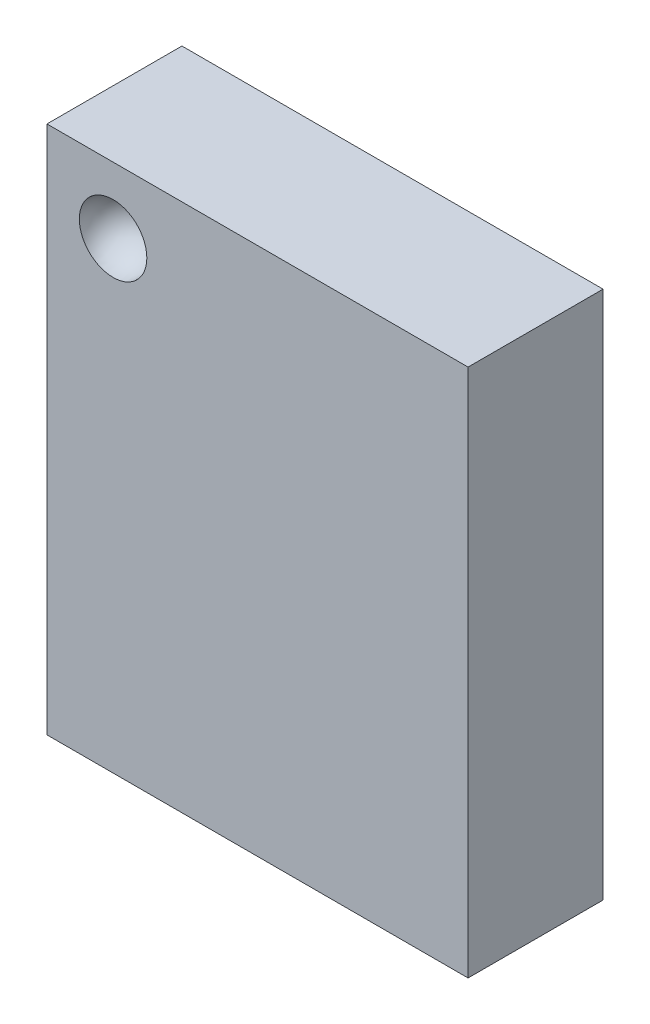
ISO-10303-21;
HEADER;
FILE_DESCRIPTION(('STEP AP214'),'2;1');
FILE_NAME('part.step','',(''),(''),'','','');
FILE_SCHEMA(('AUTOMOTIVE_DESIGN { 1 0 10303 214 1 1 1 1 }'));
ENDSEC;
DATA;
#1=APPLICATION_CONTEXT('core data for automotive mechanical design processes');
#2=APPLICATION_PROTOCOL_DEFINITION('international standard','automotive_design',2000,#1);
#3=PRODUCT_CONTEXT('',#1,'mechanical');
#4=PRODUCT('Part','Part','',(#3));
#5=PRODUCT_RELATED_PRODUCT_CATEGORY('part','',(#4));
#6=PRODUCT_DEFINITION_FORMATION('','',#4);
#7=PRODUCT_DEFINITION_CONTEXT('part definition',#1,'design');
#8=PRODUCT_DEFINITION('design','',#6,#7);
#9=PRODUCT_DEFINITION_SHAPE('','',#8);
#10=(LENGTH_UNIT() NAMED_UNIT(*) SI_UNIT(.MILLI.,.METRE.));
#11=(NAMED_UNIT(*) PLANE_ANGLE_UNIT() SI_UNIT($,.RADIAN.));
#12=(NAMED_UNIT(*) SI_UNIT($,.STERADIAN.) SOLID_ANGLE_UNIT());
#13=UNCERTAINTY_MEASURE_WITH_UNIT(LENGTH_MEASURE(1.E-05),#10,'distance_accuracy_value','');
#14=(GEOMETRIC_REPRESENTATION_CONTEXT(3) GLOBAL_UNCERTAINTY_ASSIGNED_CONTEXT((#13)) GLOBAL_UNIT_ASSIGNED_CONTEXT((#10,
#11,#12)) REPRESENTATION_CONTEXT('',''));
#15=CARTESIAN_POINT('',(0.,0.,0.));
#16=DIRECTION('',(0.,0.,1.));
#17=DIRECTION('',(1.,0.,0.));
#18=AXIS2_PLACEMENT_3D('',#15,#16,#17);
#19=CARTESIAN_POINT('',(-1.3375,1.8375,1.425));
#20=DIRECTION('',(1.,0.,0.));
#21=DIRECTION('',(0.,1.,0.));
#22=AXIS2_PLACEMENT_3D('',#19,#20,#21);
#23=SPHERICAL_SURFACE('',#22,0.3125);
#24=CARTESIAN_POINT('',(-1.3375,1.8375,1.425));
#25=DIRECTION('',(0.,0.,-1.));
#26=DIRECTION('',(1.,0.,0.));
#27=AXIS2_PLACEMENT_3D('',#24,#25,#26);
#28=CIRCLE('',#27,0.3125);
#29=CARTESIAN_POINT('',(-1.025,1.83750000001,1.425));
#30=VERTEX_POINT('',#29);
#31=CARTESIAN_POINT('',(-1.65,1.83750000001,1.425));
#32=VERTEX_POINT('',#31);
#33=EDGE_CURVE('E33',#30,#32,#28,.T.);
#34=ORIENTED_EDGE('',*,*,#33,.F.);
#35=CARTESIAN_POINT('',(-1.3375,1.8375,1.425));
#36=DIRECTION('',(0.,0.,1.));
#37=DIRECTION('',(1.,0.,0.));
#38=AXIS2_PLACEMENT_3D('',#35,#36,#37);
#39=CIRCLE('',#38,0.3125);
#40=EDGE_CURVE('E21',#32,#30,#39,.F.);
#41=ORIENTED_EDGE('',*,*,#40,.F.);
#42=EDGE_LOOP('',(#34,#41));
#43=FACE_BOUND('',#42,.T.);
#44=ADVANCED_FACE('F17',(#43),#23,.F.);
#45=CARTESIAN_POINT('',(-1.95,-2.45,1.425));
#46=DIRECTION('',(0.,0.,1.));
#47=DIRECTION('',(1.,0.,0.));
#48=AXIS2_PLACEMENT_3D('',#45,#46,#47);
#49=PLANE('',#48);
#50=ORIENTED_EDGE('',*,*,#33,.T.);
#51=ORIENTED_EDGE('',*,*,#40,.T.);
#52=EDGE_LOOP('',(#50,#51));
#53=FACE_BOUND('',#52,.T.);
#54=DIRECTION('',(0.,1.,0.));
#55=VECTOR('',#54,1.);
#56=CARTESIAN_POINT('',(1.95,-2.45,1.425));
#57=LINE('',#56,#55);
#58=CARTESIAN_POINT('',(1.95,2.45,1.425));
#59=VERTEX_POINT('',#58);
#60=CARTESIAN_POINT('',(1.95,-2.45,1.425));
#61=VERTEX_POINT('',#60);
#62=EDGE_CURVE('E91',#59,#61,#57,.F.);
#63=ORIENTED_EDGE('',*,*,#62,.F.);
#64=DIRECTION('',(1.,0.,0.));
#65=VECTOR('',#64,1.);
#66=CARTESIAN_POINT('',(-1.95,2.45,1.425));
#67=LINE('',#66,#65);
#68=CARTESIAN_POINT('',(-1.95,2.45,1.425));
#69=VERTEX_POINT('',#68);
#70=EDGE_CURVE('E66',#69,#59,#67,.T.);
#71=ORIENTED_EDGE('',*,*,#70,.F.);
#72=DIRECTION('',(0.,1.,0.));
#73=VECTOR('',#72,1.);
#74=CARTESIAN_POINT('',(-1.95,-2.45,1.425));
#75=LINE('',#74,#73);
#76=CARTESIAN_POINT('',(-1.95,-2.45,1.425));
#77=VERTEX_POINT('',#76);
#78=EDGE_CURVE('E99',#69,#77,#75,.F.);
#79=ORIENTED_EDGE('',*,*,#78,.T.);
#80=DIRECTION('',(1.,0.,0.));
#81=VECTOR('',#80,1.);
#82=CARTESIAN_POINT('',(-1.95,-2.45,1.425));
#83=LINE('',#82,#81);
#84=EDGE_CURVE('E94',#77,#61,#83,.T.);
#85=ORIENTED_EDGE('',*,*,#84,.T.);
#86=EDGE_LOOP('',(#63,#71,#79,#85));
#87=FACE_BOUND('',#86,.T.);
#88=ADVANCED_FACE('F101',(#53,#87),#49,.T.);
#89=CARTESIAN_POINT('',(-1.95,-2.45,0.175));
#90=DIRECTION('',(1.,0.,0.));
#91=DIRECTION('',(0.,0.,-1.));
#92=AXIS2_PLACEMENT_3D('',#89,#90,#91);
#93=PLANE('',#92);
#94=DIRECTION('',(0.,0.,1.));
#95=VECTOR('',#94,1.);
#96=CARTESIAN_POINT('',(-1.95,2.45,0.175));
#97=LINE('',#96,#95);
#98=CARTESIAN_POINT('',(-1.95,2.45,0.175));
#99=VERTEX_POINT('',#98);
#100=EDGE_CURVE('E89',#99,#69,#97,.T.);
#101=ORIENTED_EDGE('',*,*,#100,.F.);
#102=DIRECTION('',(0.,1.,0.));
#103=VECTOR('',#102,1.);
#104=CARTESIAN_POINT('',(-1.95,-2.45,0.175));
#105=LINE('',#104,#103);
#106=CARTESIAN_POINT('',(-1.95,-2.45,0.175));
#107=VERTEX_POINT('',#106);
#108=EDGE_CURVE('E71',#99,#107,#105,.F.);
#109=ORIENTED_EDGE('',*,*,#108,.T.);
#110=DIRECTION('',(0.,0.,1.));
#111=VECTOR('',#110,1.);
#112=CARTESIAN_POINT('',(-1.95,-2.45,0.175));
#113=LINE('',#112,#111);
#114=EDGE_CURVE('E96',#107,#77,#113,.T.);
#115=ORIENTED_EDGE('',*,*,#114,.T.);
#116=ORIENTED_EDGE('',*,*,#78,.F.);
#117=EDGE_LOOP('',(#101,#109,#115,#116));
#118=FACE_BOUND('',#117,.T.);
#119=ADVANCED_FACE('F109',(#118),#93,.F.);
#120=CARTESIAN_POINT('',(-1.95,-2.45,0.175));
#121=DIRECTION('',(0.,1.,0.));
#122=DIRECTION('',(0.,0.,1.));
#123=AXIS2_PLACEMENT_3D('',#120,#121,#122);
#124=PLANE('',#123);
#125=ORIENTED_EDGE('',*,*,#84,.F.);
#126=ORIENTED_EDGE('',*,*,#114,.F.);
#127=DIRECTION('',(1.,0.,0.));
#128=VECTOR('',#127,1.);
#129=CARTESIAN_POINT('',(-1.95,-2.45,0.175));
#130=LINE('',#129,#128);
#131=CARTESIAN_POINT('',(1.95,-2.45,0.175));
#132=VERTEX_POINT('',#131);
#133=EDGE_CURVE('E83',#107,#132,#130,.T.);
#134=ORIENTED_EDGE('',*,*,#133,.T.);
#135=DIRECTION('',(0.,0.,-1.));
#136=VECTOR('',#135,1.);
#137=CARTESIAN_POINT('',(1.95,-2.45,0.175));
#138=LINE('',#137,#136);
#139=EDGE_CURVE('E82',#61,#132,#138,.T.);
#140=ORIENTED_EDGE('',*,*,#139,.F.);
#141=EDGE_LOOP('',(#125,#126,#134,#140));
#142=FACE_BOUND('',#141,.T.);
#143=ADVANCED_FACE('F119',(#142),#124,.F.);
#144=CARTESIAN_POINT('',(1.95,-2.45,0.175));
#145=DIRECTION('',(1.,0.,0.));
#146=DIRECTION('',(0.,0.,-1.));
#147=AXIS2_PLACEMENT_3D('',#144,#145,#146);
#148=PLANE('',#147);
#149=DIRECTION('',(0.,0.,1.));
#150=VECTOR('',#149,1.);
#151=CARTESIAN_POINT('',(1.95,2.45,0.175));
#152=LINE('',#151,#150);
#153=CARTESIAN_POINT('',(1.95,2.45,0.175));
#154=VERTEX_POINT('',#153);
#155=EDGE_CURVE('E61',#59,#154,#152,.F.);
#156=ORIENTED_EDGE('',*,*,#155,.F.);
#157=ORIENTED_EDGE('',*,*,#62,.T.);
#158=ORIENTED_EDGE('',*,*,#139,.T.);
#159=DIRECTION('',(0.,1.,0.));
#160=VECTOR('',#159,1.);
#161=CARTESIAN_POINT('',(1.95,-2.45,0.175));
#162=LINE('',#161,#160);
#163=EDGE_CURVE('E27',#132,#154,#162,.T.);
#164=ORIENTED_EDGE('',*,*,#163,.T.);
#165=EDGE_LOOP('',(#156,#157,#158,#164));
#166=FACE_BOUND('',#165,.T.);
#167=ADVANCED_FACE('F80',(#166),#148,.T.);
#168=CARTESIAN_POINT('',(-1.95,2.45,0.175));
#169=DIRECTION('',(0.,1.,0.));
#170=DIRECTION('',(0.,0.,1.));
#171=AXIS2_PLACEMENT_3D('',#168,#169,#170);
#172=PLANE('',#171);
#173=ORIENTED_EDGE('',*,*,#70,.T.);
#174=ORIENTED_EDGE('',*,*,#155,.T.);
#175=DIRECTION('',(1.,0.,0.));
#176=VECTOR('',#175,1.);
#177=CARTESIAN_POINT('',(-1.95,2.45,0.175));
#178=LINE('',#177,#176);
#179=EDGE_CURVE('E11',#154,#99,#178,.F.);
#180=ORIENTED_EDGE('',*,*,#179,.T.);
#181=ORIENTED_EDGE('',*,*,#100,.T.);
#182=EDGE_LOOP('',(#173,#174,#180,#181));
#183=FACE_BOUND('',#182,.T.);
#184=ADVANCED_FACE('F63',(#183),#172,.T.);
#185=CARTESIAN_POINT('',(-1.95,-2.45,0.175));
#186=DIRECTION('',(0.,0.,1.));
#187=DIRECTION('',(1.,0.,0.));
#188=AXIS2_PLACEMENT_3D('',#185,#186,#187);
#189=PLANE('',#188);
#190=ORIENTED_EDGE('',*,*,#163,.F.);
#191=ORIENTED_EDGE('',*,*,#133,.F.);
#192=ORIENTED_EDGE('',*,*,#108,.F.);
#193=ORIENTED_EDGE('',*,*,#179,.F.);
#194=EDGE_LOOP('',(#190,#191,#192,#193));
#195=FACE_BOUND('',#194,.T.);
#196=ADVANCED_FACE('F75',(#195),#189,.F.);
#197=CLOSED_SHELL('',(#44,#88,#119,#143,#167,#184,#196));
#198=MANIFOLD_SOLID_BREP('B1',#197);
#199=ADVANCED_BREP_SHAPE_REPRESENTATION('',(#18,#198),#14);
#200=SHAPE_DEFINITION_REPRESENTATION(#9,#199);
ENDSEC;
END-ISO-10303-21;
